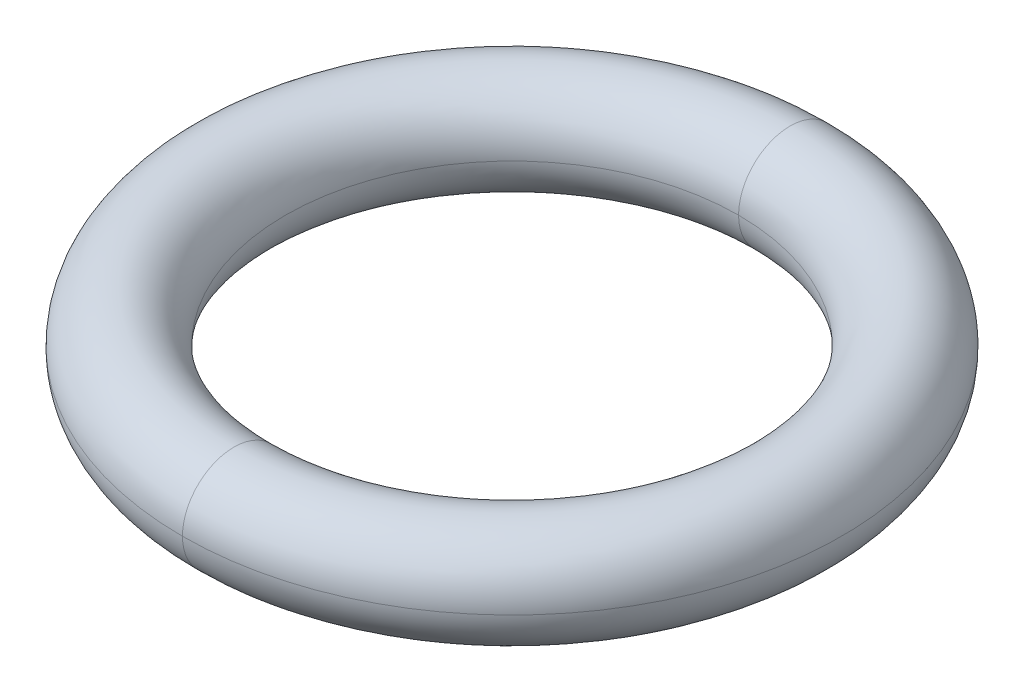
ISO-10303-21;
HEADER;
FILE_DESCRIPTION(('STEP AP214'),'2;1');
FILE_NAME('part.step','',(''),(''),'','','');
FILE_SCHEMA(('AUTOMOTIVE_DESIGN { 1 0 10303 214 1 1 1 1 }'));
ENDSEC;
DATA;
#1=APPLICATION_CONTEXT('core data for automotive mechanical design processes');
#2=APPLICATION_PROTOCOL_DEFINITION('international standard','automotive_design',2000,#1);
#3=PRODUCT_CONTEXT('',#1,'mechanical');
#4=PRODUCT('Part','Part','',(#3));
#5=PRODUCT_RELATED_PRODUCT_CATEGORY('part','',(#4));
#6=PRODUCT_DEFINITION_FORMATION('','',#4);
#7=PRODUCT_DEFINITION_CONTEXT('part definition',#1,'design');
#8=PRODUCT_DEFINITION('design','',#6,#7);
#9=PRODUCT_DEFINITION_SHAPE('','',#8);
#10=(LENGTH_UNIT() NAMED_UNIT(*) SI_UNIT(.MILLI.,.METRE.));
#11=(NAMED_UNIT(*) PLANE_ANGLE_UNIT() SI_UNIT($,.RADIAN.));
#12=(NAMED_UNIT(*) SI_UNIT($,.STERADIAN.) SOLID_ANGLE_UNIT());
#13=UNCERTAINTY_MEASURE_WITH_UNIT(LENGTH_MEASURE(1.E-05),#10,'distance_accuracy_value','');
#14=(GEOMETRIC_REPRESENTATION_CONTEXT(3) GLOBAL_UNCERTAINTY_ASSIGNED_CONTEXT((#13)) GLOBAL_UNIT_ASSIGNED_CONTEXT((#10,
#11,#12)) REPRESENTATION_CONTEXT('',''));
#15=CARTESIAN_POINT('',(0.,0.,0.));
#16=DIRECTION('',(0.,0.,1.));
#17=DIRECTION('',(1.,0.,0.));
#18=AXIS2_PLACEMENT_3D('',#15,#16,#17);
#19=CARTESIAN_POINT('',(-2.90698826646719,1.01171873202198,54.127124258992));
#20=DIRECTION('',(0.,-1.,0.));
#21=DIRECTION('',(0.,0.,1.));
#22=AXIS2_PLACEMENT_3D('',#19,#20,#21);
#23=TOROIDAL_SURFACE('',#22,5.4,1.);
#24=CARTESIAN_POINT('',(-2.90698826646719,1.01171873202198,54.127124258992));
#25=DIRECTION('',(0.,-1.,0.));
#26=DIRECTION('',(0.,0.,-1.));
#27=AXIS2_PLACEMENT_3D('',#24,#25,#26);
#28=CIRCLE('',#27,6.4);
#29=CARTESIAN_POINT('',(-2.90698826646719,1.01171873202198,60.5271242589921));
#30=VERTEX_POINT('',#29);
#31=CARTESIAN_POINT('',(-2.90698826646719,1.01171873202198,47.727124258992));
#32=VERTEX_POINT('',#31);
#33=EDGE_CURVE('E67',#30,#32,#28,.T.);
#34=ORIENTED_EDGE('',*,*,#33,.F.);
#35=CARTESIAN_POINT('',(-2.90698826646719,1.01171873202198,59.5271242589921));
#36=DIRECTION('',(1.,0.,0.));
#37=DIRECTION('',(0.,0.,-1.));
#38=AXIS2_PLACEMENT_3D('',#35,#36,#37);
#39=CIRCLE('',#38,1.);
#40=CARTESIAN_POINT('',(-2.90698826646719,1.01171873202198,58.5271242589921));
#41=VERTEX_POINT('',#40);
#42=EDGE_CURVE('E11',#41,#30,#39,.T.);
#43=ORIENTED_EDGE('',*,*,#42,.F.);
#44=CARTESIAN_POINT('',(-2.90698826646719,1.01171873202198,54.127124258992));
#45=DIRECTION('',(0.,-1.,0.));
#46=DIRECTION('',(0.,0.,-1.));
#47=AXIS2_PLACEMENT_3D('',#44,#45,#46);
#48=CIRCLE('',#47,4.4);
#49=CARTESIAN_POINT('',(-2.90698826646719,1.01171873202198,49.727124258992));
#50=VERTEX_POINT('',#49);
#51=EDGE_CURVE('E66',#41,#50,#48,.T.);
#52=ORIENTED_EDGE('',*,*,#51,.T.);
#53=CARTESIAN_POINT('',(-2.90698826646719,1.01171873202198,48.727124258992));
#54=DIRECTION('',(-1.,0.,0.));
#55=DIRECTION('',(0.,0.,1.));
#56=AXIS2_PLACEMENT_3D('',#53,#54,#55);
#57=CIRCLE('',#56,1.);
#58=EDGE_CURVE('E21',#50,#32,#57,.T.);
#59=ORIENTED_EDGE('',*,*,#58,.T.);
#60=EDGE_LOOP('',(#34,#43,#52,#59));
#61=FACE_BOUND('',#60,.T.);
#62=ADVANCED_FACE('F17',(#61),#23,.T.);
#63=CARTESIAN_POINT('',(-2.90698826646719,1.01171873202198,54.127124258992));
#64=DIRECTION('',(0.,-1.,0.));
#65=DIRECTION('',(0.,0.,1.));
#66=AXIS2_PLACEMENT_3D('',#63,#64,#65);
#67=TOROIDAL_SURFACE('',#66,5.4,1.);
#68=CARTESIAN_POINT('',(-2.90698826646719,1.01171873202198,54.127124258992));
#69=DIRECTION('',(0.,-1.,0.));
#70=DIRECTION('',(0.,0.,-1.));
#71=AXIS2_PLACEMENT_3D('',#68,#69,#70);
#72=CIRCLE('',#71,6.4);
#73=EDGE_CURVE('E53',#32,#30,#72,.T.);
#74=ORIENTED_EDGE('',*,*,#73,.F.);
#75=ORIENTED_EDGE('',*,*,#58,.F.);
#76=CARTESIAN_POINT('',(-2.90698826646719,1.01171873202198,54.127124258992));
#77=DIRECTION('',(0.,-1.,0.));
#78=DIRECTION('',(0.,0.,-1.));
#79=AXIS2_PLACEMENT_3D('',#76,#77,#78);
#80=CIRCLE('',#79,4.4);
#81=EDGE_CURVE('E55',#50,#41,#80,.T.);
#82=ORIENTED_EDGE('',*,*,#81,.T.);
#83=ORIENTED_EDGE('',*,*,#42,.T.);
#84=EDGE_LOOP('',(#74,#75,#82,#83));
#85=FACE_BOUND('',#84,.T.);
#86=ADVANCED_FACE('F19',(#85),#67,.T.);
#87=CARTESIAN_POINT('',(-2.90698826646719,1.01171873202198,54.127124258992));
#88=DIRECTION('',(0.,-1.,0.));
#89=DIRECTION('',(0.,0.,1.));
#90=AXIS2_PLACEMENT_3D('',#87,#88,#89);
#91=TOROIDAL_SURFACE('',#90,5.4,1.);
#92=CARTESIAN_POINT('',(-2.90698826646719,1.01171873202198,48.727124258992));
#93=DIRECTION('',(-1.,0.,0.));
#94=DIRECTION('',(0.,0.,1.));
#95=AXIS2_PLACEMENT_3D('',#92,#93,#94);
#96=CIRCLE('',#95,1.);
#97=EDGE_CURVE('E63',#32,#50,#96,.T.);
#98=ORIENTED_EDGE('',*,*,#97,.F.);
#99=ORIENTED_EDGE('',*,*,#73,.T.);
#100=CARTESIAN_POINT('',(-2.90698826646719,1.01171873202198,59.5271242589921));
#101=DIRECTION('',(1.,0.,0.));
#102=DIRECTION('',(0.,0.,-1.));
#103=AXIS2_PLACEMENT_3D('',#100,#101,#102);
#104=CIRCLE('',#103,1.);
#105=EDGE_CURVE('E61',#30,#41,#104,.T.);
#106=ORIENTED_EDGE('',*,*,#105,.T.);
#107=ORIENTED_EDGE('',*,*,#81,.F.);
#108=EDGE_LOOP('',(#98,#99,#106,#107));
#109=FACE_BOUND('',#108,.T.);
#110=ADVANCED_FACE('F59',(#109),#91,.T.);
#111=CARTESIAN_POINT('',(-2.90698826646719,1.01171873202198,54.127124258992));
#112=DIRECTION('',(0.,-1.,0.));
#113=DIRECTION('',(0.,0.,1.));
#114=AXIS2_PLACEMENT_3D('',#111,#112,#113);
#115=TOROIDAL_SURFACE('',#114,5.4,1.);
#116=ORIENTED_EDGE('',*,*,#105,.F.);
#117=ORIENTED_EDGE('',*,*,#33,.T.);
#118=ORIENTED_EDGE('',*,*,#97,.T.);
#119=ORIENTED_EDGE('',*,*,#51,.F.);
#120=EDGE_LOOP('',(#116,#117,#118,#119));
#121=FACE_BOUND('',#120,.T.);
#122=ADVANCED_FACE('F71',(#121),#115,.T.);
#123=CLOSED_SHELL('',(#62,#86,#110,#122));
#124=MANIFOLD_SOLID_BREP('B1',#123);
#125=ADVANCED_BREP_SHAPE_REPRESENTATION('',(#18,#124),#14);
#126=SHAPE_DEFINITION_REPRESENTATION(#9,#125);
ENDSEC;
END-ISO-10303-21;
